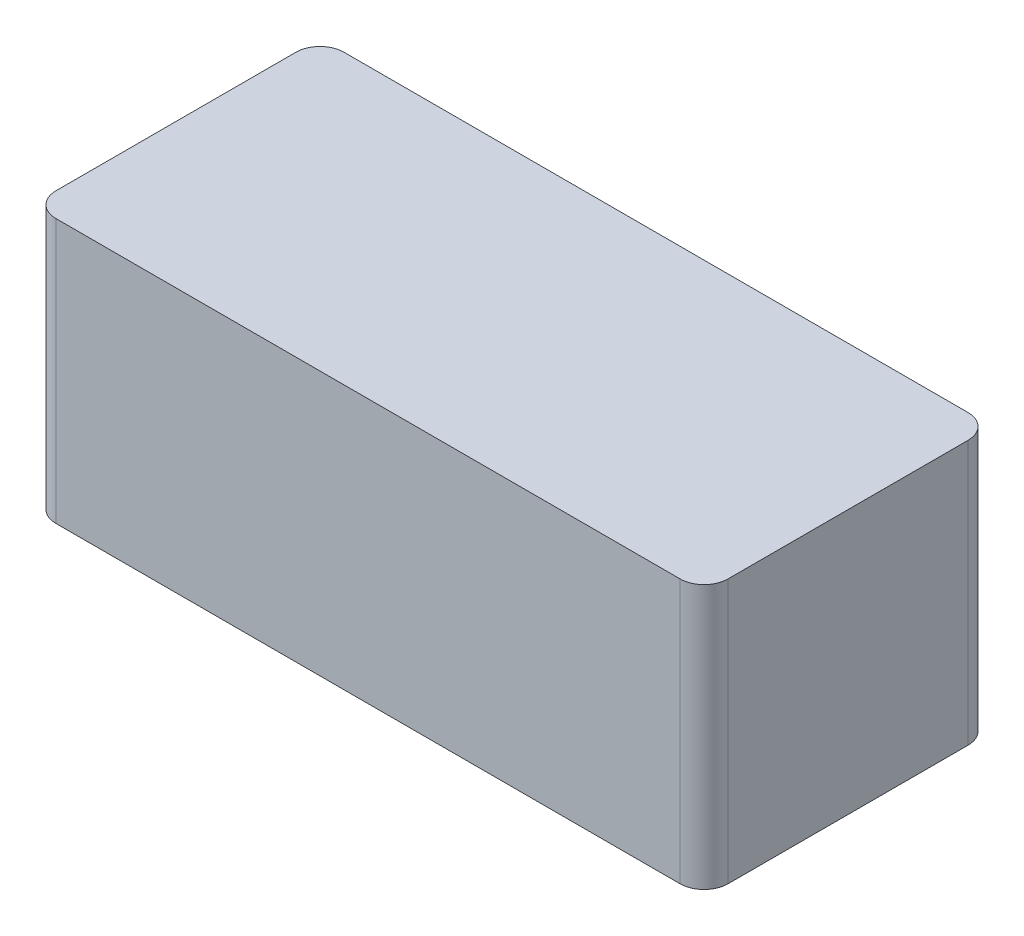
ISO-10303-21;
HEADER;
FILE_DESCRIPTION(('STEP AP214'),'2;1');
FILE_NAME('part.step','',(''),(''),'','','');
FILE_SCHEMA(('AUTOMOTIVE_DESIGN { 1 0 10303 214 1 1 1 1 }'));
ENDSEC;
DATA;
#1=APPLICATION_CONTEXT('core data for automotive mechanical design processes');
#2=APPLICATION_PROTOCOL_DEFINITION('international standard','automotive_design',2000,#1);
#3=PRODUCT_CONTEXT('',#1,'mechanical');
#4=PRODUCT('Part','Part','',(#3));
#5=PRODUCT_RELATED_PRODUCT_CATEGORY('part','',(#4));
#6=PRODUCT_DEFINITION_FORMATION('','',#4);
#7=PRODUCT_DEFINITION_CONTEXT('part definition',#1,'design');
#8=PRODUCT_DEFINITION('design','',#6,#7);
#9=PRODUCT_DEFINITION_SHAPE('','',#8);
#10=(LENGTH_UNIT() NAMED_UNIT(*) SI_UNIT(.MILLI.,.METRE.));
#11=(NAMED_UNIT(*) PLANE_ANGLE_UNIT() SI_UNIT($,.RADIAN.));
#12=(NAMED_UNIT(*) SI_UNIT($,.STERADIAN.) SOLID_ANGLE_UNIT());
#13=UNCERTAINTY_MEASURE_WITH_UNIT(LENGTH_MEASURE(1.E-05),#10,'distance_accuracy_value','');
#14=(GEOMETRIC_REPRESENTATION_CONTEXT(3) GLOBAL_UNCERTAINTY_ASSIGNED_CONTEXT((#13)) GLOBAL_UNIT_ASSIGNED_CONTEXT((#10,
#11,#12)) REPRESENTATION_CONTEXT('',''));
#15=CARTESIAN_POINT('',(0.,0.,0.));
#16=DIRECTION('',(0.,0.,1.));
#17=DIRECTION('',(1.,0.,0.));
#18=AXIS2_PLACEMENT_3D('',#15,#16,#17);
#19=CARTESIAN_POINT('',(70.,55.,30.));
#20=DIRECTION('',(-1.,0.,0.));
#21=DIRECTION('',(0.,0.,1.));
#22=AXIS2_PLACEMENT_3D('',#19,#20,#21);
#23=PLANE('',#22);
#24=DIRECTION('',(0.,0.,-1.));
#25=VECTOR('',#24,1.);
#26=CARTESIAN_POINT('',(70.,55.,30.));
#27=LINE('',#26,#25);
#28=CARTESIAN_POINT('',(70.,55.,25.));
#29=VERTEX_POINT('',#28);
#30=CARTESIAN_POINT('',(70.,55.,-25.));
#31=VERTEX_POINT('',#30);
#32=EDGE_CURVE('E121',#29,#31,#27,.T.);
#33=ORIENTED_EDGE('',*,*,#32,.F.);
#34=DIRECTION('',(0.,-1.,0.));
#35=VECTOR('',#34,1.);
#36=CARTESIAN_POINT('',(70.,55.,25.));
#37=LINE('',#36,#35);
#38=CARTESIAN_POINT('',(70.,0.,25.));
#39=VERTEX_POINT('',#38);
#40=EDGE_CURVE('E106',#29,#39,#37,.T.);
#41=ORIENTED_EDGE('',*,*,#40,.T.);
#42=DIRECTION('',(0.,0.,-1.));
#43=VECTOR('',#42,1.);
#44=CARTESIAN_POINT('',(70.,0.,30.));
#45=LINE('',#44,#43);
#46=CARTESIAN_POINT('',(70.,0.,-25.));
#47=VERTEX_POINT('',#46);
#48=EDGE_CURVE('E118',#39,#47,#45,.T.);
#49=ORIENTED_EDGE('',*,*,#48,.T.);
#50=DIRECTION('',(0.,-1.,0.));
#51=VECTOR('',#50,1.);
#52=CARTESIAN_POINT('',(70.,55.,-25.));
#53=LINE('',#52,#51);
#54=EDGE_CURVE('E123',#47,#31,#53,.F.);
#55=ORIENTED_EDGE('',*,*,#54,.T.);
#56=EDGE_LOOP('',(#33,#41,#49,#55));
#57=FACE_BOUND('',#56,.T.);
#58=ADVANCED_FACE('F37',(#57),#23,.F.);
#59=CARTESIAN_POINT('',(-70.,55.,-30.));
#60=DIRECTION('',(0.,0.,1.));
#61=DIRECTION('',(1.,0.,0.));
#62=AXIS2_PLACEMENT_3D('',#59,#60,#61);
#63=PLANE('',#62);
#64=DIRECTION('',(-1.,0.,0.));
#65=VECTOR('',#64,1.);
#66=CARTESIAN_POINT('',(-70.,55.,-30.));
#67=LINE('',#66,#65);
#68=CARTESIAN_POINT('',(65.,55.,-30.));
#69=VERTEX_POINT('',#68);
#70=CARTESIAN_POINT('',(-65.,55.,-30.));
#71=VERTEX_POINT('',#70);
#72=EDGE_CURVE('E172',#69,#71,#67,.T.);
#73=ORIENTED_EDGE('',*,*,#72,.F.);
#74=DIRECTION('',(0.,-1.,0.));
#75=VECTOR('',#74,1.);
#76=CARTESIAN_POINT('',(65.,55.,-30.));
#77=LINE('',#76,#75);
#78=CARTESIAN_POINT('',(65.,0.,-30.));
#79=VERTEX_POINT('',#78);
#80=EDGE_CURVE('E156',#69,#79,#77,.T.);
#81=ORIENTED_EDGE('',*,*,#80,.T.);
#82=DIRECTION('',(-1.,0.,0.));
#83=VECTOR('',#82,1.);
#84=CARTESIAN_POINT('',(-70.,0.,-30.));
#85=LINE('',#84,#83);
#86=CARTESIAN_POINT('',(-65.,0.,-30.));
#87=VERTEX_POINT('',#86);
#88=EDGE_CURVE('E127',#79,#87,#85,.T.);
#89=ORIENTED_EDGE('',*,*,#88,.T.);
#90=DIRECTION('',(0.,-1.,0.));
#91=VECTOR('',#90,1.);
#92=CARTESIAN_POINT('',(-65.,55.,-30.));
#93=LINE('',#92,#91);
#94=EDGE_CURVE('E154',#87,#71,#93,.F.);
#95=ORIENTED_EDGE('',*,*,#94,.T.);
#96=EDGE_LOOP('',(#73,#81,#89,#95));
#97=FACE_BOUND('',#96,.T.);
#98=ADVANCED_FACE('F182',(#97),#63,.F.);
#99=CARTESIAN_POINT('',(-70.,55.,30.));
#100=DIRECTION('',(1.,0.,0.));
#101=DIRECTION('',(0.,0.,-1.));
#102=AXIS2_PLACEMENT_3D('',#99,#100,#101);
#103=PLANE('',#102);
#104=DIRECTION('',(0.,0.,1.));
#105=VECTOR('',#104,1.);
#106=CARTESIAN_POINT('',(-70.,0.,30.));
#107=LINE('',#106,#105);
#108=CARTESIAN_POINT('',(-70.,0.,-25.));
#109=VERTEX_POINT('',#108);
#110=CARTESIAN_POINT('',(-70.,0.,25.));
#111=VERTEX_POINT('',#110);
#112=EDGE_CURVE('E130',#109,#111,#107,.T.);
#113=ORIENTED_EDGE('',*,*,#112,.T.);
#114=DIRECTION('',(0.,-1.,0.));
#115=VECTOR('',#114,1.);
#116=CARTESIAN_POINT('',(-70.,55.,25.));
#117=LINE('',#116,#115);
#118=CARTESIAN_POINT('',(-70.,55.,25.));
#119=VERTEX_POINT('',#118);
#120=EDGE_CURVE('E11',#111,#119,#117,.F.);
#121=ORIENTED_EDGE('',*,*,#120,.T.);
#122=DIRECTION('',(0.,0.,1.));
#123=VECTOR('',#122,1.);
#124=CARTESIAN_POINT('',(-70.,55.,30.));
#125=LINE('',#124,#123);
#126=CARTESIAN_POINT('',(-70.,55.,-25.));
#127=VERTEX_POINT('',#126);
#128=EDGE_CURVE('E162',#127,#119,#125,.T.);
#129=ORIENTED_EDGE('',*,*,#128,.F.);
#130=DIRECTION('',(0.,-1.,0.));
#131=VECTOR('',#130,1.);
#132=CARTESIAN_POINT('',(-70.,55.,-25.));
#133=LINE('',#132,#131);
#134=EDGE_CURVE('E45',#127,#109,#133,.T.);
#135=ORIENTED_EDGE('',*,*,#134,.T.);
#136=EDGE_LOOP('',(#113,#121,#129,#135));
#137=FACE_BOUND('',#136,.T.);
#138=ADVANCED_FACE('F161',(#137),#103,.F.);
#139=CARTESIAN_POINT('',(-70.,55.,30.));
#140=DIRECTION('',(0.,0.,-1.));
#141=DIRECTION('',(-1.,0.,0.));
#142=AXIS2_PLACEMENT_3D('',#139,#140,#141);
#143=PLANE('',#142);
#144=DIRECTION('',(1.,0.,0.));
#145=VECTOR('',#144,1.);
#146=CARTESIAN_POINT('',(-70.,0.,30.));
#147=LINE('',#146,#145);
#148=CARTESIAN_POINT('',(-65.,0.,30.));
#149=VERTEX_POINT('',#148);
#150=CARTESIAN_POINT('',(65.,0.,30.));
#151=VERTEX_POINT('',#150);
#152=EDGE_CURVE('E137',#149,#151,#147,.T.);
#153=ORIENTED_EDGE('',*,*,#152,.T.);
#154=DIRECTION('',(0.,-1.,0.));
#155=VECTOR('',#154,1.);
#156=CARTESIAN_POINT('',(65.,55.,30.));
#157=LINE('',#156,#155);
#158=CARTESIAN_POINT('',(65.,55.,30.));
#159=VERTEX_POINT('',#158);
#160=EDGE_CURVE('E107',#151,#159,#157,.F.);
#161=ORIENTED_EDGE('',*,*,#160,.T.);
#162=DIRECTION('',(1.,0.,0.));
#163=VECTOR('',#162,1.);
#164=CARTESIAN_POINT('',(-70.,55.,30.));
#165=LINE('',#164,#163);
#166=CARTESIAN_POINT('',(-65.,55.,30.));
#167=VERTEX_POINT('',#166);
#168=EDGE_CURVE('E133',#167,#159,#165,.T.);
#169=ORIENTED_EDGE('',*,*,#168,.F.);
#170=DIRECTION('',(0.,-1.,0.));
#171=VECTOR('',#170,1.);
#172=CARTESIAN_POINT('',(-65.,55.,30.));
#173=LINE('',#172,#171);
#174=EDGE_CURVE('E112',#167,#149,#173,.T.);
#175=ORIENTED_EDGE('',*,*,#174,.T.);
#176=EDGE_LOOP('',(#153,#161,#169,#175));
#177=FACE_BOUND('',#176,.T.);
#178=ADVANCED_FACE('F170',(#177),#143,.F.);
#179=CARTESIAN_POINT('',(0.,55.,0.));
#180=DIRECTION('',(0.,-1.,0.));
#181=DIRECTION('',(0.,0.,-1.));
#182=AXIS2_PLACEMENT_3D('',#179,#180,#181);
#183=PLANE('',#182);
#184=ORIENTED_EDGE('',*,*,#168,.T.);
#185=CARTESIAN_POINT('',(65.,55.,25.));
#186=DIRECTION('',(0.,-1.,0.));
#187=DIRECTION('',(0.,0.,-1.));
#188=AXIS2_PLACEMENT_3D('',#185,#186,#187);
#189=CIRCLE('',#188,5.);
#190=EDGE_CURVE('E152',#159,#29,#189,.F.);
#191=ORIENTED_EDGE('',*,*,#190,.T.);
#192=ORIENTED_EDGE('',*,*,#32,.T.);
#193=CARTESIAN_POINT('',(65.,55.,-25.));
#194=DIRECTION('',(0.,-1.,0.));
#195=DIRECTION('',(0.,0.,-1.));
#196=AXIS2_PLACEMENT_3D('',#193,#194,#195);
#197=CIRCLE('',#196,5.);
#198=EDGE_CURVE('E150',#31,#69,#197,.F.);
#199=ORIENTED_EDGE('',*,*,#198,.T.);
#200=ORIENTED_EDGE('',*,*,#72,.T.);
#201=CARTESIAN_POINT('',(-65.,55.,-25.));
#202=DIRECTION('',(0.,-1.,0.));
#203=DIRECTION('',(0.,0.,-1.));
#204=AXIS2_PLACEMENT_3D('',#201,#202,#203);
#205=CIRCLE('',#204,5.);
#206=EDGE_CURVE('E57',#71,#127,#205,.F.);
#207=ORIENTED_EDGE('',*,*,#206,.T.);
#208=ORIENTED_EDGE('',*,*,#128,.T.);
#209=CARTESIAN_POINT('',(-65.,55.,25.));
#210=DIRECTION('',(0.,-1.,0.));
#211=DIRECTION('',(0.,0.,-1.));
#212=AXIS2_PLACEMENT_3D('',#209,#210,#211);
#213=CIRCLE('',#212,5.);
#214=EDGE_CURVE('E148',#119,#167,#213,.F.);
#215=ORIENTED_EDGE('',*,*,#214,.T.);
#216=EDGE_LOOP('',(#184,#191,#192,#199,#200,#207,#208,#215));
#217=FACE_BOUND('',#216,.T.);
#218=ADVANCED_FACE('F176',(#217),#183,.F.);
#219=CARTESIAN_POINT('',(0.,0.,0.));
#220=DIRECTION('',(0.,-1.,0.));
#221=DIRECTION('',(0.,0.,-1.));
#222=AXIS2_PLACEMENT_3D('',#219,#220,#221);
#223=PLANE('',#222);
#224=ORIENTED_EDGE('',*,*,#48,.F.);
#225=CARTESIAN_POINT('',(65.,0.,25.));
#226=DIRECTION('',(0.,-1.,0.));
#227=DIRECTION('',(0.,0.,-1.));
#228=AXIS2_PLACEMENT_3D('',#225,#226,#227);
#229=CIRCLE('',#228,5.);
#230=EDGE_CURVE('E102',#39,#151,#229,.T.);
#231=ORIENTED_EDGE('',*,*,#230,.T.);
#232=ORIENTED_EDGE('',*,*,#152,.F.);
#233=CARTESIAN_POINT('',(-65.,0.,25.));
#234=DIRECTION('',(0.,-1.,0.));
#235=DIRECTION('',(0.,0.,-1.));
#236=AXIS2_PLACEMENT_3D('',#233,#234,#235);
#237=CIRCLE('',#236,5.);
#238=EDGE_CURVE('E141',#149,#111,#237,.T.);
#239=ORIENTED_EDGE('',*,*,#238,.T.);
#240=ORIENTED_EDGE('',*,*,#112,.F.);
#241=CARTESIAN_POINT('',(-65.,0.,-25.));
#242=DIRECTION('',(0.,-1.,0.));
#243=DIRECTION('',(0.,0.,-1.));
#244=AXIS2_PLACEMENT_3D('',#241,#242,#243);
#245=CIRCLE('',#244,5.);
#246=EDGE_CURVE('E122',#109,#87,#245,.T.);
#247=ORIENTED_EDGE('',*,*,#246,.T.);
#248=ORIENTED_EDGE('',*,*,#88,.F.);
#249=CARTESIAN_POINT('',(65.,0.,-25.));
#250=DIRECTION('',(0.,-1.,0.));
#251=DIRECTION('',(0.,0.,-1.));
#252=AXIS2_PLACEMENT_3D('',#249,#250,#251);
#253=CIRCLE('',#252,5.);
#254=EDGE_CURVE('E113',#79,#47,#253,.T.);
#255=ORIENTED_EDGE('',*,*,#254,.T.);
#256=EDGE_LOOP('',(#224,#231,#232,#239,#240,#247,#248,#255));
#257=FACE_BOUND('',#256,.T.);
#258=ADVANCED_FACE('F125',(#257),#223,.T.);
#259=CARTESIAN_POINT('',(65.,55.,25.));
#260=DIRECTION('',(0.,-1.,0.));
#261=DIRECTION('',(0.,0.,-1.));
#262=AXIS2_PLACEMENT_3D('',#259,#260,#261);
#263=CYLINDRICAL_SURFACE('',#262,5.);
#264=ORIENTED_EDGE('',*,*,#190,.F.);
#265=ORIENTED_EDGE('',*,*,#160,.F.);
#266=ORIENTED_EDGE('',*,*,#230,.F.);
#267=ORIENTED_EDGE('',*,*,#40,.F.);
#268=EDGE_LOOP('',(#264,#265,#266,#267));
#269=FACE_BOUND('',#268,.T.);
#270=ADVANCED_FACE('F105',(#269),#263,.T.);
#271=CARTESIAN_POINT('',(65.,55.,-25.));
#272=DIRECTION('',(0.,-1.,0.));
#273=DIRECTION('',(0.,0.,-1.));
#274=AXIS2_PLACEMENT_3D('',#271,#272,#273);
#275=CYLINDRICAL_SURFACE('',#274,5.);
#276=ORIENTED_EDGE('',*,*,#198,.F.);
#277=ORIENTED_EDGE('',*,*,#54,.F.);
#278=ORIENTED_EDGE('',*,*,#254,.F.);
#279=ORIENTED_EDGE('',*,*,#80,.F.);
#280=EDGE_LOOP('',(#276,#277,#278,#279));
#281=FACE_BOUND('',#280,.T.);
#282=ADVANCED_FACE('F180',(#281),#275,.T.);
#283=CARTESIAN_POINT('',(-65.,55.,25.));
#284=DIRECTION('',(0.,-1.,0.));
#285=DIRECTION('',(0.,0.,-1.));
#286=AXIS2_PLACEMENT_3D('',#283,#284,#285);
#287=CYLINDRICAL_SURFACE('',#286,5.);
#288=ORIENTED_EDGE('',*,*,#214,.F.);
#289=ORIENTED_EDGE('',*,*,#120,.F.);
#290=ORIENTED_EDGE('',*,*,#238,.F.);
#291=ORIENTED_EDGE('',*,*,#174,.F.);
#292=EDGE_LOOP('',(#288,#289,#290,#291));
#293=FACE_BOUND('',#292,.T.);
#294=ADVANCED_FACE('F167',(#293),#287,.T.);
#295=CARTESIAN_POINT('',(-65.,55.,-25.));
#296=DIRECTION('',(0.,-1.,0.));
#297=DIRECTION('',(0.,0.,-1.));
#298=AXIS2_PLACEMENT_3D('',#295,#296,#297);
#299=CYLINDRICAL_SURFACE('',#298,5.);
#300=ORIENTED_EDGE('',*,*,#206,.F.);
#301=ORIENTED_EDGE('',*,*,#94,.F.);
#302=ORIENTED_EDGE('',*,*,#246,.F.);
#303=ORIENTED_EDGE('',*,*,#134,.F.);
#304=EDGE_LOOP('',(#300,#301,#302,#303));
#305=FACE_BOUND('',#304,.T.);
#306=ADVANCED_FACE('F39',(#305),#299,.T.);
#307=CLOSED_SHELL('',(#58,#98,#138,#178,#218,#258,#270,#282,#294,#306));
#308=MANIFOLD_SOLID_BREP('B2',#307);
#309=ADVANCED_BREP_SHAPE_REPRESENTATION('',(#18,#308),#14);
#310=SHAPE_DEFINITION_REPRESENTATION(#9,#309);
ENDSEC;
END-ISO-10303-21;
